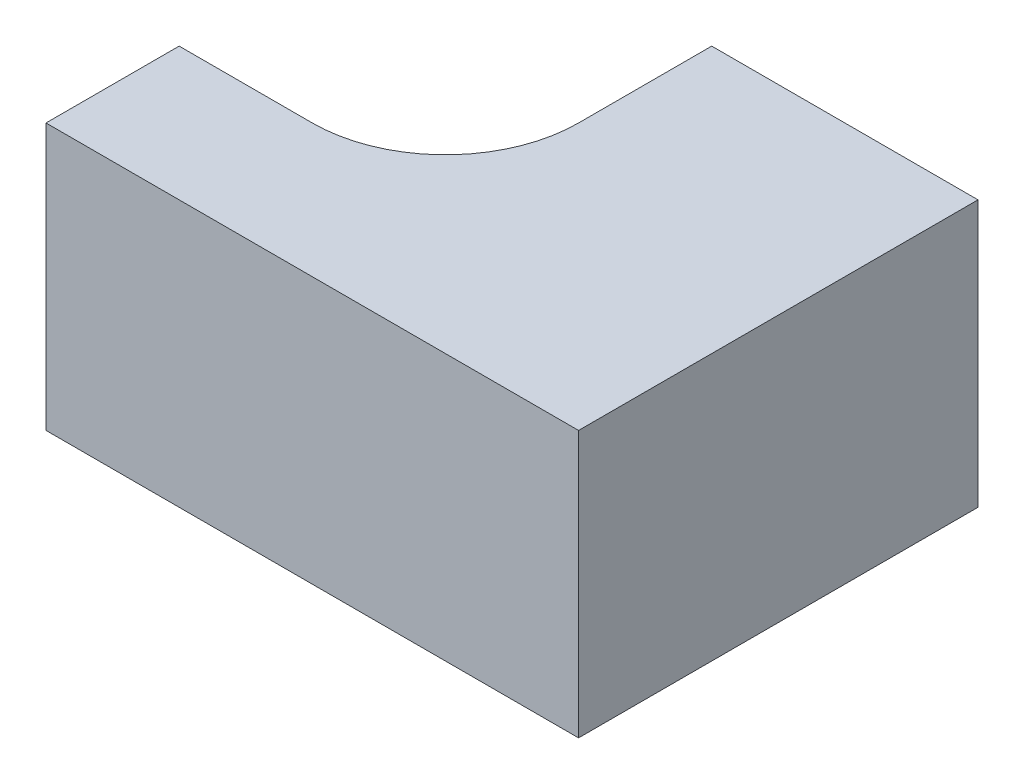
ISO-10303-21;
HEADER;
FILE_DESCRIPTION(('STEP AP214'),'2;1');
FILE_NAME('part.step','',(''),(''),'','','');
FILE_SCHEMA(('AUTOMOTIVE_DESIGN { 1 0 10303 214 1 1 1 1 }'));
ENDSEC;
DATA;
#1=APPLICATION_CONTEXT('core data for automotive mechanical design processes');
#2=APPLICATION_PROTOCOL_DEFINITION('international standard','automotive_design',2000,#1);
#3=PRODUCT_CONTEXT('',#1,'mechanical');
#4=PRODUCT('Part','Part','',(#3));
#5=PRODUCT_RELATED_PRODUCT_CATEGORY('part','',(#4));
#6=PRODUCT_DEFINITION_FORMATION('','',#4);
#7=PRODUCT_DEFINITION_CONTEXT('part definition',#1,'design');
#8=PRODUCT_DEFINITION('design','',#6,#7);
#9=PRODUCT_DEFINITION_SHAPE('','',#8);
#10=(LENGTH_UNIT() NAMED_UNIT(*) SI_UNIT(.MILLI.,.METRE.));
#11=(NAMED_UNIT(*) PLANE_ANGLE_UNIT() SI_UNIT($,.RADIAN.));
#12=(NAMED_UNIT(*) SI_UNIT($,.STERADIAN.) SOLID_ANGLE_UNIT());
#13=UNCERTAINTY_MEASURE_WITH_UNIT(LENGTH_MEASURE(1.E-05),#10,'distance_accuracy_value','');
#14=(GEOMETRIC_REPRESENTATION_CONTEXT(3) GLOBAL_UNCERTAINTY_ASSIGNED_CONTEXT((#13)) GLOBAL_UNIT_ASSIGNED_CONTEXT((#10,
#11,#12)) REPRESENTATION_CONTEXT('',''));
#15=CARTESIAN_POINT('',(0.,0.,0.));
#16=DIRECTION('',(0.,0.,1.));
#17=DIRECTION('',(1.,0.,0.));
#18=AXIS2_PLACEMENT_3D('',#15,#16,#17);
#19=CARTESIAN_POINT('',(-20.,20.,0.));
#20=DIRECTION('',(0.,0.,1.));
#21=DIRECTION('',(-1.,0.,0.));
#22=AXIS2_PLACEMENT_3D('',#19,#20,#21);
#23=PLANE('',#22);
#24=DIRECTION('',(1.,0.,0.));
#25=VECTOR('',#24,1.);
#26=CARTESIAN_POINT('',(-20.,0.,0.));
#27=LINE('',#26,#25);
#28=CARTESIAN_POINT('',(-40.,0.,0.));
#29=VERTEX_POINT('',#28);
#30=CARTESIAN_POINT('',(-20.,0.,0.));
#31=VERTEX_POINT('',#30);
#32=EDGE_CURVE('E134',#29,#31,#27,.T.);
#33=ORIENTED_EDGE('',*,*,#32,.F.);
#34=DIRECTION('',(0.,-1.,0.));
#35=VECTOR('',#34,1.);
#36=CARTESIAN_POINT('',(-40.,20.,0.));
#37=LINE('',#36,#35);
#38=CARTESIAN_POINT('',(-40.,20.,0.));
#39=VERTEX_POINT('',#38);
#40=EDGE_CURVE('E133',#39,#29,#37,.T.);
#41=ORIENTED_EDGE('',*,*,#40,.F.);
#42=DIRECTION('',(1.,0.,0.));
#43=VECTOR('',#42,1.);
#44=CARTESIAN_POINT('',(-20.,20.,0.));
#45=LINE('',#44,#43);
#46=CARTESIAN_POINT('',(-20.,20.,0.));
#47=VERTEX_POINT('',#46);
#48=EDGE_CURVE('E156',#39,#47,#45,.T.);
#49=ORIENTED_EDGE('',*,*,#48,.T.);
#50=DIRECTION('',(0.,-1.,0.));
#51=VECTOR('',#50,1.);
#52=CARTESIAN_POINT('',(-20.,20.,0.));
#53=LINE('',#52,#51);
#54=EDGE_CURVE('E11',#47,#31,#53,.T.);
#55=ORIENTED_EDGE('',*,*,#54,.T.);
#56=EDGE_LOOP('',(#33,#41,#49,#55));
#57=FACE_BOUND('',#56,.T.);
#58=ADVANCED_FACE('F38',(#57),#23,.F.);
#59=CARTESIAN_POINT('',(-20.,20.,30.));
#60=DIRECTION('',(-1.,0.,0.));
#61=DIRECTION('',(0.,0.,-1.));
#62=AXIS2_PLACEMENT_3D('',#59,#60,#61);
#63=PLANE('',#62);
#64=DIRECTION('',(0.,0.,1.));
#65=VECTOR('',#64,1.);
#66=CARTESIAN_POINT('',(-20.,0.,30.));
#67=LINE('',#66,#65);
#68=CARTESIAN_POINT('',(-20.,0.,30.));
#69=VERTEX_POINT('',#68);
#70=EDGE_CURVE('E137',#31,#69,#67,.T.);
#71=ORIENTED_EDGE('',*,*,#70,.F.);
#72=ORIENTED_EDGE('',*,*,#54,.F.);
#73=DIRECTION('',(0.,0.,1.));
#74=VECTOR('',#73,1.);
#75=CARTESIAN_POINT('',(-20.,20.,30.));
#76=LINE('',#75,#74);
#77=CARTESIAN_POINT('',(-20.,20.,30.));
#78=VERTEX_POINT('',#77);
#79=EDGE_CURVE('E90',#47,#78,#76,.T.);
#80=ORIENTED_EDGE('',*,*,#79,.T.);
#81=DIRECTION('',(0.,-1.,0.));
#82=VECTOR('',#81,1.);
#83=CARTESIAN_POINT('',(-20.,20.,30.));
#84=LINE('',#83,#82);
#85=EDGE_CURVE('E47',#78,#69,#84,.T.);
#86=ORIENTED_EDGE('',*,*,#85,.T.);
#87=EDGE_LOOP('',(#71,#72,#80,#86));
#88=FACE_BOUND('',#87,.T.);
#89=ADVANCED_FACE('F170',(#88),#63,.F.);
#90=CARTESIAN_POINT('',(-60.,20.,30.));
#91=DIRECTION('',(0.,0.,-1.));
#92=DIRECTION('',(1.,0.,0.));
#93=AXIS2_PLACEMENT_3D('',#90,#91,#92);
#94=PLANE('',#93);
#95=DIRECTION('',(-1.,0.,0.));
#96=VECTOR('',#95,1.);
#97=CARTESIAN_POINT('',(-60.,0.,30.));
#98=LINE('',#97,#96);
#99=CARTESIAN_POINT('',(-60.,0.,30.));
#100=VERTEX_POINT('',#99);
#101=EDGE_CURVE('E141',#69,#100,#98,.T.);
#102=ORIENTED_EDGE('',*,*,#101,.F.);
#103=ORIENTED_EDGE('',*,*,#85,.F.);
#104=DIRECTION('',(-1.,0.,0.));
#105=VECTOR('',#104,1.);
#106=CARTESIAN_POINT('',(-60.,20.,30.));
#107=LINE('',#106,#105);
#108=CARTESIAN_POINT('',(-60.,20.,30.));
#109=VERTEX_POINT('',#108);
#110=EDGE_CURVE('E127',#78,#109,#107,.T.);
#111=ORIENTED_EDGE('',*,*,#110,.T.);
#112=DIRECTION('',(0.,-1.,0.));
#113=VECTOR('',#112,1.);
#114=CARTESIAN_POINT('',(-60.,20.,30.));
#115=LINE('',#114,#113);
#116=EDGE_CURVE('E163',#109,#100,#115,.T.);
#117=ORIENTED_EDGE('',*,*,#116,.T.);
#118=EDGE_LOOP('',(#102,#103,#111,#117));
#119=FACE_BOUND('',#118,.T.);
#120=ADVANCED_FACE('F183',(#119),#94,.F.);
#121=CARTESIAN_POINT('',(-60.,20.,20.));
#122=DIRECTION('',(1.,0.,0.));
#123=DIRECTION('',(0.,0.,1.));
#124=AXIS2_PLACEMENT_3D('',#121,#122,#123);
#125=PLANE('',#124);
#126=DIRECTION('',(0.,0.,-1.));
#127=VECTOR('',#126,1.);
#128=CARTESIAN_POINT('',(-60.,0.,20.));
#129=LINE('',#128,#127);
#130=CARTESIAN_POINT('',(-60.,0.,20.));
#131=VERTEX_POINT('',#130);
#132=EDGE_CURVE('E145',#100,#131,#129,.T.);
#133=ORIENTED_EDGE('',*,*,#132,.F.);
#134=ORIENTED_EDGE('',*,*,#116,.F.);
#135=DIRECTION('',(0.,0.,-1.));
#136=VECTOR('',#135,1.);
#137=CARTESIAN_POINT('',(-60.,20.,20.));
#138=LINE('',#137,#136);
#139=CARTESIAN_POINT('',(-60.,20.,20.));
#140=VERTEX_POINT('',#139);
#141=EDGE_CURVE('E124',#109,#140,#138,.T.);
#142=ORIENTED_EDGE('',*,*,#141,.T.);
#143=DIRECTION('',(0.,-1.,0.));
#144=VECTOR('',#143,1.);
#145=CARTESIAN_POINT('',(-60.,20.,20.));
#146=LINE('',#145,#144);
#147=EDGE_CURVE('E117',#140,#131,#146,.T.);
#148=ORIENTED_EDGE('',*,*,#147,.T.);
#149=EDGE_LOOP('',(#133,#134,#142,#148));
#150=FACE_BOUND('',#149,.T.);
#151=ADVANCED_FACE('F186',(#150),#125,.F.);
#152=CARTESIAN_POINT('',(-50.,20.,20.));
#153=DIRECTION('',(0.,0.,1.));
#154=DIRECTION('',(-1.,0.,0.));
#155=AXIS2_PLACEMENT_3D('',#152,#153,#154);
#156=PLANE('',#155);
#157=DIRECTION('',(1.,0.,0.));
#158=VECTOR('',#157,1.);
#159=CARTESIAN_POINT('',(-50.,0.,20.));
#160=LINE('',#159,#158);
#161=CARTESIAN_POINT('',(-50.,0.,20.));
#162=VERTEX_POINT('',#161);
#163=EDGE_CURVE('E149',#131,#162,#160,.T.);
#164=ORIENTED_EDGE('',*,*,#163,.F.);
#165=ORIENTED_EDGE('',*,*,#147,.F.);
#166=DIRECTION('',(1.,0.,0.));
#167=VECTOR('',#166,1.);
#168=CARTESIAN_POINT('',(-50.,20.,20.));
#169=LINE('',#168,#167);
#170=CARTESIAN_POINT('',(-50.,20.,20.));
#171=VERTEX_POINT('',#170);
#172=EDGE_CURVE('E105',#140,#171,#169,.T.);
#173=ORIENTED_EDGE('',*,*,#172,.T.);
#174=DIRECTION('',(0.,-1.,0.));
#175=VECTOR('',#174,1.);
#176=CARTESIAN_POINT('',(-50.,20.,20.));
#177=LINE('',#176,#175);
#178=EDGE_CURVE('E111',#171,#162,#177,.T.);
#179=ORIENTED_EDGE('',*,*,#178,.T.);
#180=EDGE_LOOP('',(#164,#165,#173,#179));
#181=FACE_BOUND('',#180,.T.);
#182=ADVANCED_FACE('F120',(#181),#156,.F.);
#183=CARTESIAN_POINT('',(-50.,20.,10.));
#184=DIRECTION('',(0.,-1.,0.));
#185=DIRECTION('',(0.,0.,-1.));
#186=AXIS2_PLACEMENT_3D('',#183,#184,#185);
#187=CYLINDRICAL_SURFACE('',#186,10.);
#188=CARTESIAN_POINT('',(-50.,0.,10.));
#189=DIRECTION('',(0.,1.,0.));
#190=DIRECTION('',(0.,0.,1.));
#191=AXIS2_PLACEMENT_3D('',#188,#189,#190);
#192=CIRCLE('',#191,10.);
#193=CARTESIAN_POINT('',(-40.,0.,10.));
#194=VERTEX_POINT('',#193);
#195=EDGE_CURVE('E113',#162,#194,#192,.T.);
#196=ORIENTED_EDGE('',*,*,#195,.F.);
#197=ORIENTED_EDGE('',*,*,#178,.F.);
#198=CARTESIAN_POINT('',(-50.,20.,10.));
#199=DIRECTION('',(0.,1.,0.));
#200=DIRECTION('',(0.,0.,1.));
#201=AXIS2_PLACEMENT_3D('',#198,#199,#200);
#202=CIRCLE('',#201,10.);
#203=CARTESIAN_POINT('',(-40.,20.,10.));
#204=VERTEX_POINT('',#203);
#205=EDGE_CURVE('E101',#171,#204,#202,.T.);
#206=ORIENTED_EDGE('',*,*,#205,.T.);
#207=DIRECTION('',(0.,-1.,0.));
#208=VECTOR('',#207,1.);
#209=CARTESIAN_POINT('',(-40.,20.,10.));
#210=LINE('',#209,#208);
#211=EDGE_CURVE('E118',#204,#194,#210,.T.);
#212=ORIENTED_EDGE('',*,*,#211,.T.);
#213=EDGE_LOOP('',(#196,#197,#206,#212));
#214=FACE_BOUND('',#213,.T.);
#215=ADVANCED_FACE('F112',(#214),#187,.F.);
#216=CARTESIAN_POINT('',(-40.,20.,0.));
#217=DIRECTION('',(1.,0.,0.));
#218=DIRECTION('',(0.,0.,1.));
#219=AXIS2_PLACEMENT_3D('',#216,#217,#218);
#220=PLANE('',#219);
#221=DIRECTION('',(0.,0.,-1.));
#222=VECTOR('',#221,1.);
#223=CARTESIAN_POINT('',(-40.,0.,0.));
#224=LINE('',#223,#222);
#225=EDGE_CURVE('E78',#194,#29,#224,.T.);
#226=ORIENTED_EDGE('',*,*,#225,.F.);
#227=ORIENTED_EDGE('',*,*,#211,.F.);
#228=DIRECTION('',(0.,0.,-1.));
#229=VECTOR('',#228,1.);
#230=CARTESIAN_POINT('',(-40.,20.,0.));
#231=LINE('',#230,#229);
#232=EDGE_CURVE('E55',#204,#39,#231,.T.);
#233=ORIENTED_EDGE('',*,*,#232,.T.);
#234=ORIENTED_EDGE('',*,*,#40,.T.);
#235=EDGE_LOOP('',(#226,#227,#233,#234));
#236=FACE_BOUND('',#235,.T.);
#237=ADVANCED_FACE('F226',(#236),#220,.F.);
#238=CARTESIAN_POINT('',(-50.,20.,10.));
#239=DIRECTION('',(0.,1.,0.));
#240=DIRECTION('',(0.,0.,1.));
#241=AXIS2_PLACEMENT_3D('',#238,#239,#240);
#242=PLANE('',#241);
#243=ORIENTED_EDGE('',*,*,#48,.F.);
#244=ORIENTED_EDGE('',*,*,#232,.F.);
#245=ORIENTED_EDGE('',*,*,#205,.F.);
#246=ORIENTED_EDGE('',*,*,#172,.F.);
#247=ORIENTED_EDGE('',*,*,#141,.F.);
#248=ORIENTED_EDGE('',*,*,#110,.F.);
#249=ORIENTED_EDGE('',*,*,#79,.F.);
#250=EDGE_LOOP('',(#243,#244,#245,#246,#247,#248,#249));
#251=FACE_BOUND('',#250,.T.);
#252=ADVANCED_FACE('F103',(#251),#242,.T.);
#253=CARTESIAN_POINT('',(-50.,0.,10.));
#254=DIRECTION('',(0.,1.,0.));
#255=DIRECTION('',(0.,0.,1.));
#256=AXIS2_PLACEMENT_3D('',#253,#254,#255);
#257=PLANE('',#256);
#258=ORIENTED_EDGE('',*,*,#32,.T.);
#259=ORIENTED_EDGE('',*,*,#70,.T.);
#260=ORIENTED_EDGE('',*,*,#101,.T.);
#261=ORIENTED_EDGE('',*,*,#132,.T.);
#262=ORIENTED_EDGE('',*,*,#163,.T.);
#263=ORIENTED_EDGE('',*,*,#195,.T.);
#264=ORIENTED_EDGE('',*,*,#225,.T.);
#265=EDGE_LOOP('',(#258,#259,#260,#261,#262,#263,#264));
#266=FACE_BOUND('',#265,.T.);
#267=ADVANCED_FACE('F173',(#266),#257,.F.);
#268=CLOSED_SHELL('',(#58,#89,#120,#151,#182,#215,#237,#252,#267));
#269=MANIFOLD_SOLID_BREP('B2',#268);
#270=ADVANCED_BREP_SHAPE_REPRESENTATION('',(#18,#269),#14);
#271=SHAPE_DEFINITION_REPRESENTATION(#9,#270);
ENDSEC;
END-ISO-10303-21;
